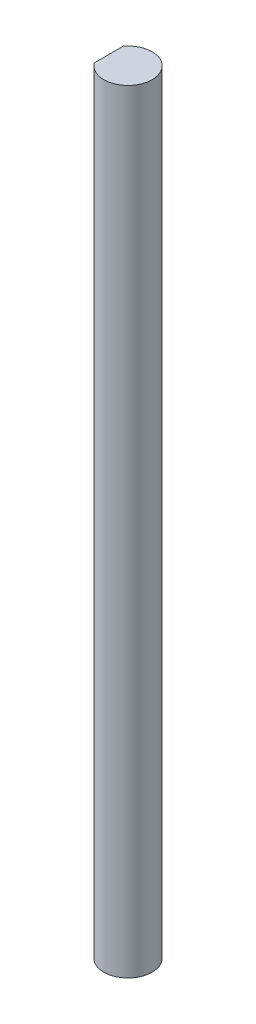
ISO-10303-21;
HEADER;
FILE_DESCRIPTION(('STEP AP214'),'2;1');
FILE_NAME('part.step','',(''),(''),'','','');
FILE_SCHEMA(('AUTOMOTIVE_DESIGN { 1 0 10303 214 1 1 1 1 }'));
ENDSEC;
DATA;
#1=APPLICATION_CONTEXT('core data for automotive mechanical design processes');
#2=APPLICATION_PROTOCOL_DEFINITION('international standard','automotive_design',2000,#1);
#3=PRODUCT_CONTEXT('',#1,'mechanical');
#4=PRODUCT('Part','Part','',(#3));
#5=PRODUCT_RELATED_PRODUCT_CATEGORY('part','',(#4));
#6=PRODUCT_DEFINITION_FORMATION('','',#4);
#7=PRODUCT_DEFINITION_CONTEXT('part definition',#1,'design');
#8=PRODUCT_DEFINITION('design','',#6,#7);
#9=PRODUCT_DEFINITION_SHAPE('','',#8);
#10=(LENGTH_UNIT() NAMED_UNIT(*) SI_UNIT(.MILLI.,.METRE.));
#11=(NAMED_UNIT(*) PLANE_ANGLE_UNIT() SI_UNIT($,.RADIAN.));
#12=(NAMED_UNIT(*) SI_UNIT($,.STERADIAN.) SOLID_ANGLE_UNIT());
#13=UNCERTAINTY_MEASURE_WITH_UNIT(LENGTH_MEASURE(1.E-05),#10,'distance_accuracy_value','');
#14=(GEOMETRIC_REPRESENTATION_CONTEXT(3) GLOBAL_UNCERTAINTY_ASSIGNED_CONTEXT((#13)) GLOBAL_UNIT_ASSIGNED_CONTEXT((#10,
#11,#12)) REPRESENTATION_CONTEXT('',''));
#15=CARTESIAN_POINT('',(0.,0.,0.));
#16=DIRECTION('',(0.,0.,1.));
#17=DIRECTION('',(1.,0.,0.));
#18=AXIS2_PLACEMENT_3D('',#15,#16,#17);
#19=CARTESIAN_POINT('',(0.,101.6,0.));
#20=DIRECTION('',(0.,-1.,0.));
#21=DIRECTION('',(0.,0.,-1.));
#22=AXIS2_PLACEMENT_3D('',#19,#20,#21);
#23=CYLINDRICAL_SURFACE('',#22,3.175);
#24=CARTESIAN_POINT('',(0.,0.,0.));
#25=DIRECTION('',(0.,1.,0.));
#26=DIRECTION('',(0.,0.,1.));
#27=AXIS2_PLACEMENT_3D('',#24,#25,#26);
#28=CIRCLE('',#27,3.175);
#29=CARTESIAN_POINT('',(-2.54,0.,1.905));
#30=VERTEX_POINT('',#29);
#31=CARTESIAN_POINT('',(-2.54,0.,-1.905));
#32=VERTEX_POINT('',#31);
#33=EDGE_CURVE('E65',#30,#32,#28,.T.);
#34=ORIENTED_EDGE('',*,*,#33,.T.);
#35=DIRECTION('',(0.,-1.,0.));
#36=VECTOR('',#35,1.);
#37=CARTESIAN_POINT('',(-2.54,101.6,-1.905));
#38=LINE('',#37,#36);
#39=CARTESIAN_POINT('',(-2.54,101.6,-1.905));
#40=VERTEX_POINT('',#39);
#41=EDGE_CURVE('E11',#40,#32,#38,.T.);
#42=ORIENTED_EDGE('',*,*,#41,.F.);
#43=CARTESIAN_POINT('',(0.,101.6,0.));
#44=DIRECTION('',(0.,1.,0.));
#45=DIRECTION('',(0.,0.,1.));
#46=AXIS2_PLACEMENT_3D('',#43,#44,#45);
#47=CIRCLE('',#46,3.175);
#48=CARTESIAN_POINT('',(-2.54,101.6,1.905));
#49=VERTEX_POINT('',#48);
#50=EDGE_CURVE('E64',#49,#40,#47,.T.);
#51=ORIENTED_EDGE('',*,*,#50,.F.);
#52=DIRECTION('',(0.,-1.,0.));
#53=VECTOR('',#52,1.);
#54=CARTESIAN_POINT('',(-2.54,101.6,1.905));
#55=LINE('',#54,#53);
#56=EDGE_CURVE('E42',#49,#30,#55,.T.);
#57=ORIENTED_EDGE('',*,*,#56,.T.);
#58=EDGE_LOOP('',(#34,#42,#51,#57));
#59=FACE_BOUND('',#58,.T.);
#60=ADVANCED_FACE('F34',(#59),#23,.T.);
#61=CARTESIAN_POINT('',(-2.54,101.6,1.905));
#62=DIRECTION('',(1.,0.,0.));
#63=DIRECTION('',(0.,0.,-1.));
#64=AXIS2_PLACEMENT_3D('',#61,#62,#63);
#65=PLANE('',#64);
#66=DIRECTION('',(0.,0.,1.));
#67=VECTOR('',#66,1.);
#68=CARTESIAN_POINT('',(-2.54,0.,1.905));
#69=LINE('',#68,#67);
#70=EDGE_CURVE('E57',#32,#30,#69,.T.);
#71=ORIENTED_EDGE('',*,*,#70,.T.);
#72=ORIENTED_EDGE('',*,*,#56,.F.);
#73=DIRECTION('',(0.,0.,1.));
#74=VECTOR('',#73,1.);
#75=CARTESIAN_POINT('',(-2.54,101.6,1.905));
#76=LINE('',#75,#74);
#77=EDGE_CURVE('E49',#40,#49,#76,.T.);
#78=ORIENTED_EDGE('',*,*,#77,.F.);
#79=ORIENTED_EDGE('',*,*,#41,.T.);
#80=EDGE_LOOP('',(#71,#72,#78,#79));
#81=FACE_BOUND('',#80,.T.);
#82=ADVANCED_FACE('F60',(#81),#65,.F.);
#83=CARTESIAN_POINT('',(0.,101.6,0.));
#84=DIRECTION('',(0.,1.,0.));
#85=DIRECTION('',(0.,0.,1.));
#86=AXIS2_PLACEMENT_3D('',#83,#84,#85);
#87=PLANE('',#86);
#88=ORIENTED_EDGE('',*,*,#50,.T.);
#89=ORIENTED_EDGE('',*,*,#77,.T.);
#90=EDGE_LOOP('',(#88,#89));
#91=FACE_BOUND('',#90,.T.);
#92=ADVANCED_FACE('F72',(#91),#87,.T.);
#93=CARTESIAN_POINT('',(0.,0.,0.));
#94=DIRECTION('',(0.,1.,0.));
#95=DIRECTION('',(0.,0.,1.));
#96=AXIS2_PLACEMENT_3D('',#93,#94,#95);
#97=PLANE('',#96);
#98=ORIENTED_EDGE('',*,*,#33,.F.);
#99=ORIENTED_EDGE('',*,*,#70,.F.);
#100=EDGE_LOOP('',(#98,#99));
#101=FACE_BOUND('',#100,.T.);
#102=ADVANCED_FACE('F68',(#101),#97,.F.);
#103=CLOSED_SHELL('',(#60,#82,#92,#102));
#104=MANIFOLD_SOLID_BREP('B2',#103);
#105=ADVANCED_BREP_SHAPE_REPRESENTATION('',(#18,#104),#14);
#106=SHAPE_DEFINITION_REPRESENTATION(#9,#105);
ENDSEC;
END-ISO-10303-21;
